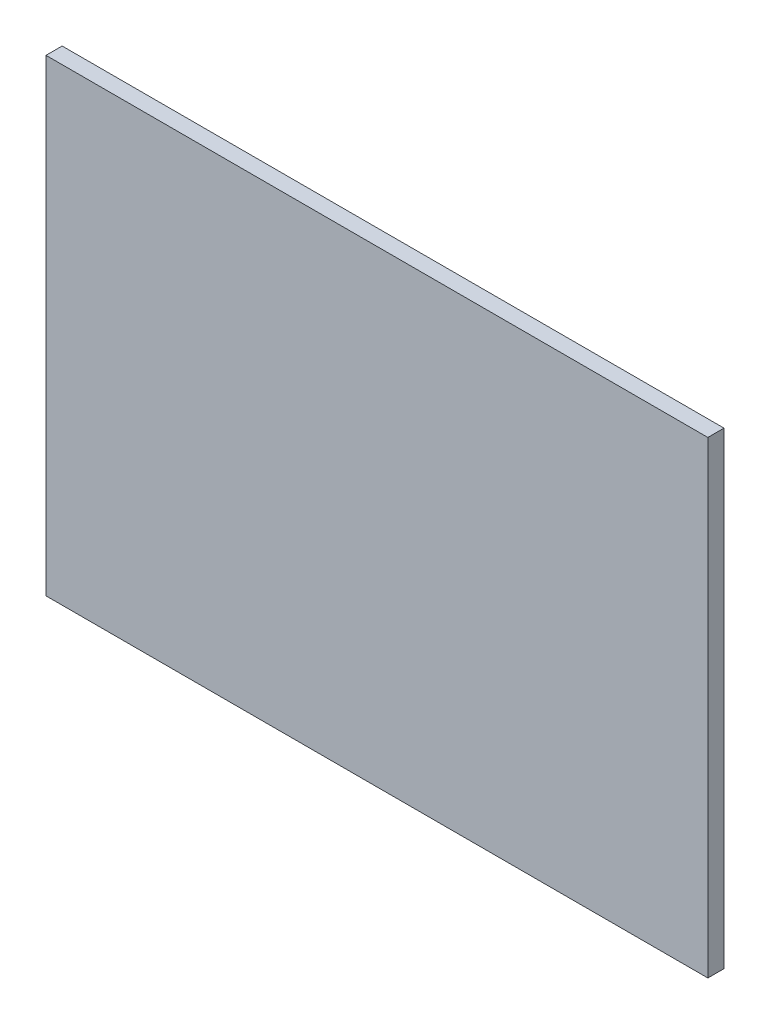
ISO-10303-21;
HEADER;
FILE_DESCRIPTION(('STEP AP214'),'2;1');
FILE_NAME('part.step','',(''),(''),'','','');
FILE_SCHEMA(('AUTOMOTIVE_DESIGN { 1 0 10303 214 1 1 1 1 }'));
ENDSEC;
DATA;
#1=APPLICATION_CONTEXT('core data for automotive mechanical design processes');
#2=APPLICATION_PROTOCOL_DEFINITION('international standard','automotive_design',2000,#1);
#3=PRODUCT_CONTEXT('',#1,'mechanical');
#4=PRODUCT('Part','Part','',(#3));
#5=PRODUCT_RELATED_PRODUCT_CATEGORY('part','',(#4));
#6=PRODUCT_DEFINITION_FORMATION('','',#4);
#7=PRODUCT_DEFINITION_CONTEXT('part definition',#1,'design');
#8=PRODUCT_DEFINITION('design','',#6,#7);
#9=PRODUCT_DEFINITION_SHAPE('','',#8);
#10=(LENGTH_UNIT() NAMED_UNIT(*) SI_UNIT(.MILLI.,.METRE.));
#11=(NAMED_UNIT(*) PLANE_ANGLE_UNIT() SI_UNIT($,.RADIAN.));
#12=(NAMED_UNIT(*) SI_UNIT($,.STERADIAN.) SOLID_ANGLE_UNIT());
#13=UNCERTAINTY_MEASURE_WITH_UNIT(LENGTH_MEASURE(1.E-05),#10,'distance_accuracy_value','');
#14=(GEOMETRIC_REPRESENTATION_CONTEXT(3) GLOBAL_UNCERTAINTY_ASSIGNED_CONTEXT((#13)) GLOBAL_UNIT_ASSIGNED_CONTEXT((#10,
#11,#12)) REPRESENTATION_CONTEXT('',''));
#15=CARTESIAN_POINT('',(0.,0.,0.));
#16=DIRECTION('',(0.,0.,1.));
#17=DIRECTION('',(1.,0.,0.));
#18=AXIS2_PLACEMENT_3D('',#15,#16,#17);
#19=CARTESIAN_POINT('',(-7.10842449721226,45.4624783362218,2.));
#20=DIRECTION('',(1.,0.,0.));
#21=DIRECTION('',(0.,0.,-1.));
#22=AXIS2_PLACEMENT_3D('',#19,#20,#21);
#23=PLANE('',#22);
#24=DIRECTION('',(0.,-1.,0.));
#25=VECTOR('',#24,1.);
#26=CARTESIAN_POINT('',(-7.10842449721226,45.4624783362218,0.));
#27=LINE('',#26,#25);
#28=CARTESIAN_POINT('',(-7.10842449721226,45.4624783362218,0.));
#29=VERTEX_POINT('',#28);
#30=CARTESIAN_POINT('',(-7.10842449721226,-12.5375216637782,0.));
#31=VERTEX_POINT('',#30);
#32=EDGE_CURVE('E97',#29,#31,#27,.T.);
#33=ORIENTED_EDGE('',*,*,#32,.T.);
#34=DIRECTION('',(0.,0.,-1.));
#35=VECTOR('',#34,1.);
#36=CARTESIAN_POINT('',(-7.10842449721226,-12.5375216637782,2.));
#37=LINE('',#36,#35);
#38=CARTESIAN_POINT('',(-7.10842449721226,-12.5375216637782,2.));
#39=VERTEX_POINT('',#38);
#40=EDGE_CURVE('E11',#39,#31,#37,.T.);
#41=ORIENTED_EDGE('',*,*,#40,.F.);
#42=DIRECTION('',(0.,-1.,0.));
#43=VECTOR('',#42,1.);
#44=CARTESIAN_POINT('',(-7.10842449721226,45.4624783362218,2.));
#45=LINE('',#44,#43);
#46=CARTESIAN_POINT('',(-7.10842449721226,45.4624783362218,2.));
#47=VERTEX_POINT('',#46);
#48=EDGE_CURVE('E85',#47,#39,#45,.T.);
#49=ORIENTED_EDGE('',*,*,#48,.F.);
#50=DIRECTION('',(0.,0.,-1.));
#51=VECTOR('',#50,1.);
#52=CARTESIAN_POINT('',(-7.10842449721226,45.4624783362218,2.));
#53=LINE('',#52,#51);
#54=EDGE_CURVE('E93',#47,#29,#53,.T.);
#55=ORIENTED_EDGE('',*,*,#54,.T.);
#56=EDGE_LOOP('',(#33,#41,#49,#55));
#57=FACE_BOUND('',#56,.T.);
#58=ADVANCED_FACE('F34',(#57),#23,.F.);
#59=CARTESIAN_POINT('',(-7.10842449721226,-12.5375216637782,2.));
#60=DIRECTION('',(0.,1.,0.));
#61=DIRECTION('',(0.,0.,1.));
#62=AXIS2_PLACEMENT_3D('',#59,#60,#61);
#63=PLANE('',#62);
#64=DIRECTION('',(1.,0.,0.));
#65=VECTOR('',#64,1.);
#66=CARTESIAN_POINT('',(-7.10842449721226,-12.5375216637782,0.));
#67=LINE('',#66,#65);
#68=CARTESIAN_POINT('',(74.8915755027878,-12.5375216637782,0.));
#69=VERTEX_POINT('',#68);
#70=EDGE_CURVE('E89',#31,#69,#67,.T.);
#71=ORIENTED_EDGE('',*,*,#70,.T.);
#72=DIRECTION('',(0.,0.,-1.));
#73=VECTOR('',#72,1.);
#74=CARTESIAN_POINT('',(74.8915755027878,-12.5375216637782,2.));
#75=LINE('',#74,#73);
#76=CARTESIAN_POINT('',(74.8915755027878,-12.5375216637782,2.));
#77=VERTEX_POINT('',#76);
#78=EDGE_CURVE('E42',#77,#69,#75,.T.);
#79=ORIENTED_EDGE('',*,*,#78,.F.);
#80=DIRECTION('',(1.,0.,0.));
#81=VECTOR('',#80,1.);
#82=CARTESIAN_POINT('',(-7.10842449721226,-12.5375216637782,2.));
#83=LINE('',#82,#81);
#84=EDGE_CURVE('E80',#39,#77,#83,.T.);
#85=ORIENTED_EDGE('',*,*,#84,.F.);
#86=ORIENTED_EDGE('',*,*,#40,.T.);
#87=EDGE_LOOP('',(#71,#79,#85,#86));
#88=FACE_BOUND('',#87,.T.);
#89=ADVANCED_FACE('F88',(#88),#63,.F.);
#90=CARTESIAN_POINT('',(74.8915755027877,45.4624783362218,2.));
#91=DIRECTION('',(-1.,0.,0.));
#92=DIRECTION('',(0.,-1.,0.));
#93=AXIS2_PLACEMENT_3D('',#90,#91,#92);
#94=PLANE('',#93);
#95=DIRECTION('',(0.,1.,0.));
#96=VECTOR('',#95,1.);
#97=CARTESIAN_POINT('',(74.8915755027877,45.4624783362218,0.));
#98=LINE('',#97,#96);
#99=CARTESIAN_POINT('',(74.8915755027877,45.4624783362218,0.));
#100=VERTEX_POINT('',#99);
#101=EDGE_CURVE('E67',#69,#100,#98,.T.);
#102=ORIENTED_EDGE('',*,*,#101,.T.);
#103=DIRECTION('',(0.,0.,-1.));
#104=VECTOR('',#103,1.);
#105=CARTESIAN_POINT('',(74.8915755027877,45.4624783362218,2.));
#106=LINE('',#105,#104);
#107=CARTESIAN_POINT('',(74.8915755027877,45.4624783362218,2.));
#108=VERTEX_POINT('',#107);
#109=EDGE_CURVE('E90',#108,#100,#106,.T.);
#110=ORIENTED_EDGE('',*,*,#109,.F.);
#111=DIRECTION('',(0.,1.,0.));
#112=VECTOR('',#111,1.);
#113=CARTESIAN_POINT('',(74.8915755027877,45.4624783362218,2.));
#114=LINE('',#113,#112);
#115=EDGE_CURVE('E83',#77,#108,#114,.T.);
#116=ORIENTED_EDGE('',*,*,#115,.F.);
#117=ORIENTED_EDGE('',*,*,#78,.T.);
#118=EDGE_LOOP('',(#102,#110,#116,#117));
#119=FACE_BOUND('',#118,.T.);
#120=ADVANCED_FACE('F91',(#119),#94,.F.);
#121=CARTESIAN_POINT('',(-7.10842449721226,45.4624783362218,2.));
#122=DIRECTION('',(0.,-1.,0.));
#123=DIRECTION('',(0.,0.,-1.));
#124=AXIS2_PLACEMENT_3D('',#121,#122,#123);
#125=PLANE('',#124);
#126=DIRECTION('',(-1.,0.,0.));
#127=VECTOR('',#126,1.);
#128=CARTESIAN_POINT('',(-7.10842449721226,45.4624783362218,0.));
#129=LINE('',#128,#127);
#130=EDGE_CURVE('E73',#100,#29,#129,.T.);
#131=ORIENTED_EDGE('',*,*,#130,.T.);
#132=ORIENTED_EDGE('',*,*,#54,.F.);
#133=DIRECTION('',(-1.,0.,0.));
#134=VECTOR('',#133,1.);
#135=CARTESIAN_POINT('',(-7.10842449721226,45.4624783362218,2.));
#136=LINE('',#135,#134);
#137=EDGE_CURVE('E50',#108,#47,#136,.T.);
#138=ORIENTED_EDGE('',*,*,#137,.F.);
#139=ORIENTED_EDGE('',*,*,#109,.T.);
#140=EDGE_LOOP('',(#131,#132,#138,#139));
#141=FACE_BOUND('',#140,.T.);
#142=ADVANCED_FACE('F104',(#141),#125,.F.);
#143=CARTESIAN_POINT('',(0.,0.,2.));
#144=DIRECTION('',(0.,0.,1.));
#145=DIRECTION('',(1.,0.,0.));
#146=AXIS2_PLACEMENT_3D('',#143,#144,#145);
#147=PLANE('',#146);
#148=ORIENTED_EDGE('',*,*,#48,.T.);
#149=ORIENTED_EDGE('',*,*,#84,.T.);
#150=ORIENTED_EDGE('',*,*,#115,.T.);
#151=ORIENTED_EDGE('',*,*,#137,.T.);
#152=EDGE_LOOP('',(#148,#149,#150,#151));
#153=FACE_BOUND('',#152,.T.);
#154=ADVANCED_FACE('F81',(#153),#147,.T.);
#155=CARTESIAN_POINT('',(0.,0.,0.));
#156=DIRECTION('',(0.,0.,1.));
#157=DIRECTION('',(1.,0.,0.));
#158=AXIS2_PLACEMENT_3D('',#155,#156,#157);
#159=PLANE('',#158);
#160=ORIENTED_EDGE('',*,*,#32,.F.);
#161=ORIENTED_EDGE('',*,*,#130,.F.);
#162=ORIENTED_EDGE('',*,*,#101,.F.);
#163=ORIENTED_EDGE('',*,*,#70,.F.);
#164=EDGE_LOOP('',(#160,#161,#162,#163));
#165=FACE_BOUND('',#164,.T.);
#166=ADVANCED_FACE('F107',(#165),#159,.F.);
#167=CLOSED_SHELL('',(#58,#89,#120,#142,#154,#166));
#168=MANIFOLD_SOLID_BREP('B2',#167);
#169=ADVANCED_BREP_SHAPE_REPRESENTATION('',(#18,#168),#14);
#170=SHAPE_DEFINITION_REPRESENTATION(#9,#169);
ENDSEC;
END-ISO-10303-21;
